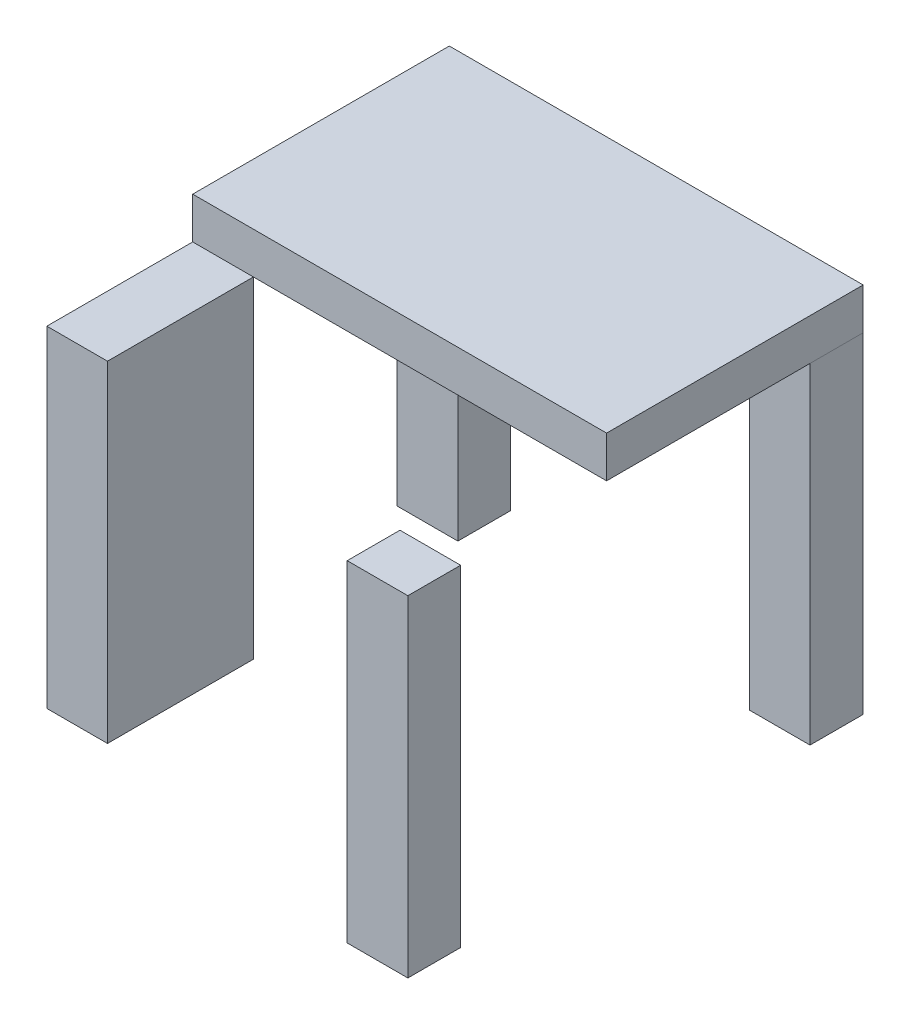
ISO-10303-21;
HEADER;
FILE_DESCRIPTION(('STEP AP214'),'2;1');
FILE_NAME('part.step','',(''),(''),'','','');
FILE_SCHEMA(('AUTOMOTIVE_DESIGN { 1 0 10303 214 1 1 1 1 }'));
ENDSEC;
DATA;
#1=APPLICATION_CONTEXT('core data for automotive mechanical design processes');
#2=APPLICATION_PROTOCOL_DEFINITION('international standard','automotive_design',2000,#1);
#3=PRODUCT_CONTEXT('',#1,'mechanical');
#4=PRODUCT('Part','Part','',(#3));
#5=PRODUCT_RELATED_PRODUCT_CATEGORY('part','',(#4));
#6=PRODUCT_DEFINITION_FORMATION('','',#4);
#7=PRODUCT_DEFINITION_CONTEXT('part definition',#1,'design');
#8=PRODUCT_DEFINITION('design','',#6,#7);
#9=PRODUCT_DEFINITION_SHAPE('','',#8);
#10=(LENGTH_UNIT() NAMED_UNIT(*) SI_UNIT(.MILLI.,.METRE.));
#11=(NAMED_UNIT(*) PLANE_ANGLE_UNIT() SI_UNIT($,.RADIAN.));
#12=(NAMED_UNIT(*) SI_UNIT($,.STERADIAN.) SOLID_ANGLE_UNIT());
#13=UNCERTAINTY_MEASURE_WITH_UNIT(LENGTH_MEASURE(1.E-05),#10,'distance_accuracy_value','');
#14=(GEOMETRIC_REPRESENTATION_CONTEXT(3) GLOBAL_UNCERTAINTY_ASSIGNED_CONTEXT((#13)) GLOBAL_UNIT_ASSIGNED_CONTEXT((#10,
#11,#12)) REPRESENTATION_CONTEXT('',''));
#15=CARTESIAN_POINT('',(0.,0.,0.));
#16=DIRECTION('',(0.,0.,1.));
#17=DIRECTION('',(1.,0.,0.));
#18=AXIS2_PLACEMENT_3D('',#15,#16,#17);
#19=CARTESIAN_POINT('',(85.36181093433,-80.,110.034688240795));
#20=DIRECTION('',(1.,0.,0.));
#21=DIRECTION('',(0.,0.,-1.));
#22=AXIS2_PLACEMENT_3D('',#19,#20,#21);
#23=PLANE('',#22);
#24=DIRECTION('',(0.,0.,-1.));
#25=VECTOR('',#24,1.);
#26=CARTESIAN_POINT('',(85.36181093433,0.,110.034688240795));
#27=LINE('',#26,#25);
#28=CARTESIAN_POINT('',(85.36181093433,0.,110.034688240795));
#29=VERTEX_POINT('',#28);
#30=CARTESIAN_POINT('',(85.36181093433,0.,97.2842820171065));
#31=VERTEX_POINT('',#30);
#32=EDGE_CURVE('E107',#29,#31,#27,.T.);
#33=ORIENTED_EDGE('',*,*,#32,.T.);
#34=DIRECTION('',(0.,1.,0.));
#35=VECTOR('',#34,1.);
#36=CARTESIAN_POINT('',(85.36181093433,-80.,97.2842820171065));
#37=LINE('',#36,#35);
#38=CARTESIAN_POINT('',(85.36181093433,-80.,97.2842820171065));
#39=VERTEX_POINT('',#38);
#40=EDGE_CURVE('E12',#39,#31,#37,.T.);
#41=ORIENTED_EDGE('',*,*,#40,.F.);
#42=DIRECTION('',(0.,0.,-1.));
#43=VECTOR('',#42,1.);
#44=CARTESIAN_POINT('',(85.36181093433,-80.,110.034688240795));
#45=LINE('',#44,#43);
#46=CARTESIAN_POINT('',(85.36181093433,-80.,110.034688240795));
#47=VERTEX_POINT('',#46);
#48=EDGE_CURVE('E95',#47,#39,#45,.T.);
#49=ORIENTED_EDGE('',*,*,#48,.F.);
#50=DIRECTION('',(0.,1.,0.));
#51=VECTOR('',#50,1.);
#52=CARTESIAN_POINT('',(85.36181093433,-80.,110.034688240795));
#53=LINE('',#52,#51);
#54=EDGE_CURVE('E103',#47,#29,#53,.T.);
#55=ORIENTED_EDGE('',*,*,#54,.T.);
#56=EDGE_LOOP('',(#33,#41,#49,#55));
#57=FACE_BOUND('',#56,.T.);
#58=ADVANCED_FACE('F44',(#57),#23,.F.);
#59=CARTESIAN_POINT('',(85.36181093433,-80.,97.2842820171065));
#60=DIRECTION('',(0.,0.,1.));
#61=DIRECTION('',(1.,0.,0.));
#62=AXIS2_PLACEMENT_3D('',#59,#60,#61);
#63=PLANE('',#62);
#64=DIRECTION('',(1.,0.,0.));
#65=VECTOR('',#64,1.);
#66=CARTESIAN_POINT('',(85.36181093433,0.,97.2842820171065));
#67=LINE('',#66,#65);
#68=CARTESIAN_POINT('',(100.019107271016,0.,97.2842820171065));
#69=VERTEX_POINT('',#68);
#70=EDGE_CURVE('E99',#31,#69,#67,.T.);
#71=ORIENTED_EDGE('',*,*,#70,.T.);
#72=DIRECTION('',(0.,1.,0.));
#73=VECTOR('',#72,1.);
#74=CARTESIAN_POINT('',(100.019107271016,-80.,97.2842820171065));
#75=LINE('',#74,#73);
#76=CARTESIAN_POINT('',(100.019107271016,-80.,97.2842820171065));
#77=VERTEX_POINT('',#76);
#78=EDGE_CURVE('E52',#77,#69,#75,.T.);
#79=ORIENTED_EDGE('',*,*,#78,.F.);
#80=DIRECTION('',(1.,0.,0.));
#81=VECTOR('',#80,1.);
#82=CARTESIAN_POINT('',(85.36181093433,-80.,97.2842820171065));
#83=LINE('',#82,#81);
#84=EDGE_CURVE('E90',#39,#77,#83,.T.);
#85=ORIENTED_EDGE('',*,*,#84,.F.);
#86=ORIENTED_EDGE('',*,*,#40,.T.);
#87=EDGE_LOOP('',(#71,#79,#85,#86));
#88=FACE_BOUND('',#87,.T.);
#89=ADVANCED_FACE('F98',(#88),#63,.F.);
#90=CARTESIAN_POINT('',(100.019107271016,-80.,110.034688240795));
#91=DIRECTION('',(-1.,0.,0.));
#92=DIRECTION('',(0.,0.,1.));
#93=AXIS2_PLACEMENT_3D('',#90,#91,#92);
#94=PLANE('',#93);
#95=DIRECTION('',(0.,0.,1.));
#96=VECTOR('',#95,1.);
#97=CARTESIAN_POINT('',(100.019107271016,0.,110.034688240795));
#98=LINE('',#97,#96);
#99=CARTESIAN_POINT('',(100.019107271016,0.,110.034688240795));
#100=VERTEX_POINT('',#99);
#101=EDGE_CURVE('E77',#69,#100,#98,.T.);
#102=ORIENTED_EDGE('',*,*,#101,.T.);
#103=DIRECTION('',(0.,1.,0.));
#104=VECTOR('',#103,1.);
#105=CARTESIAN_POINT('',(100.019107271016,-80.,110.034688240795));
#106=LINE('',#105,#104);
#107=CARTESIAN_POINT('',(100.019107271016,-80.,110.034688240795));
#108=VERTEX_POINT('',#107);
#109=EDGE_CURVE('E100',#108,#100,#106,.T.);
#110=ORIENTED_EDGE('',*,*,#109,.F.);
#111=DIRECTION('',(0.,0.,1.));
#112=VECTOR('',#111,1.);
#113=CARTESIAN_POINT('',(100.019107271016,-80.,110.034688240795));
#114=LINE('',#113,#112);
#115=EDGE_CURVE('E93',#77,#108,#114,.T.);
#116=ORIENTED_EDGE('',*,*,#115,.F.);
#117=ORIENTED_EDGE('',*,*,#78,.T.);
#118=EDGE_LOOP('',(#102,#110,#116,#117));
#119=FACE_BOUND('',#118,.T.);
#120=ADVANCED_FACE('F101',(#119),#94,.F.);
#121=CARTESIAN_POINT('',(85.36181093433,-80.,110.034688240795));
#122=DIRECTION('',(0.,0.,-1.));
#123=DIRECTION('',(-1.,0.,0.));
#124=AXIS2_PLACEMENT_3D('',#121,#122,#123);
#125=PLANE('',#124);
#126=DIRECTION('',(-1.,0.,0.));
#127=VECTOR('',#126,1.);
#128=CARTESIAN_POINT('',(85.36181093433,0.,110.034688240795));
#129=LINE('',#128,#127);
#130=EDGE_CURVE('E83',#100,#29,#129,.T.);
#131=ORIENTED_EDGE('',*,*,#130,.T.);
#132=ORIENTED_EDGE('',*,*,#54,.F.);
#133=DIRECTION('',(-1.,0.,0.));
#134=VECTOR('',#133,1.);
#135=CARTESIAN_POINT('',(85.36181093433,-80.,110.034688240795));
#136=LINE('',#135,#134);
#137=EDGE_CURVE('E60',#108,#47,#136,.T.);
#138=ORIENTED_EDGE('',*,*,#137,.F.);
#139=ORIENTED_EDGE('',*,*,#109,.T.);
#140=EDGE_LOOP('',(#131,#132,#138,#139));
#141=FACE_BOUND('',#140,.T.);
#142=ADVANCED_FACE('F114',(#141),#125,.F.);
#143=CARTESIAN_POINT('',(0.,-80.,0.));
#144=DIRECTION('',(0.,-1.,0.));
#145=DIRECTION('',(0.,0.,-1.));
#146=AXIS2_PLACEMENT_3D('',#143,#144,#145);
#147=PLANE('',#146);
#148=ORIENTED_EDGE('',*,*,#48,.T.);
#149=ORIENTED_EDGE('',*,*,#84,.T.);
#150=ORIENTED_EDGE('',*,*,#115,.T.);
#151=ORIENTED_EDGE('',*,*,#137,.T.);
#152=EDGE_LOOP('',(#148,#149,#150,#151));
#153=FACE_BOUND('',#152,.T.);
#154=ADVANCED_FACE('F91',(#153),#147,.T.);
#155=CARTESIAN_POINT('',(0.,0.,0.));
#156=DIRECTION('',(0.,-1.,0.));
#157=DIRECTION('',(0.,0.,-1.));
#158=AXIS2_PLACEMENT_3D('',#155,#156,#157);
#159=PLANE('',#158);
#160=ORIENTED_EDGE('',*,*,#32,.F.);
#161=ORIENTED_EDGE('',*,*,#130,.F.);
#162=ORIENTED_EDGE('',*,*,#101,.F.);
#163=ORIENTED_EDGE('',*,*,#70,.F.);
#164=EDGE_LOOP('',(#160,#161,#162,#163));
#165=FACE_BOUND('',#164,.T.);
#166=ADVANCED_FACE('F117',(#165),#159,.F.);
#167=CLOSED_SHELL('',(#58,#89,#120,#142,#154,#166));
#168=MANIFOLD_SOLID_BREP('B2',#167);
#169=CARTESIAN_POINT('',(0.,-80.,62.));
#170=DIRECTION('',(1.,0.,0.));
#171=DIRECTION('',(0.,0.,-1.));
#172=AXIS2_PLACEMENT_3D('',#169,#170,#171);
#173=PLANE('',#172);
#174=DIRECTION('',(0.,0.,-1.));
#175=VECTOR('',#174,1.);
#176=CARTESIAN_POINT('',(0.,0.,62.));
#177=LINE('',#176,#175);
#178=CARTESIAN_POINT('',(0.,0.,97.2495937763114));
#179=VERTEX_POINT('',#178);
#180=CARTESIAN_POINT('',(0.,0.,62.));
#181=VERTEX_POINT('',#180);
#182=EDGE_CURVE('E240',#179,#181,#177,.T.);
#183=ORIENTED_EDGE('',*,*,#182,.T.);
#184=DIRECTION('',(0.,1.,0.));
#185=VECTOR('',#184,1.);
#186=CARTESIAN_POINT('',(0.,-80.,62.));
#187=LINE('',#186,#185);
#188=CARTESIAN_POINT('',(0.,-80.,62.));
#189=VERTEX_POINT('',#188);
#190=EDGE_CURVE('E42',#189,#181,#187,.T.);
#191=ORIENTED_EDGE('',*,*,#190,.F.);
#192=DIRECTION('',(0.,0.,-1.));
#193=VECTOR('',#192,1.);
#194=CARTESIAN_POINT('',(0.,-80.,62.));
#195=LINE('',#194,#193);
#196=CARTESIAN_POINT('',(0.,-80.,97.2495937763114));
#197=VERTEX_POINT('',#196);
#198=EDGE_CURVE('E228',#197,#189,#195,.T.);
#199=ORIENTED_EDGE('',*,*,#198,.F.);
#200=DIRECTION('',(0.,1.,0.));
#201=VECTOR('',#200,1.);
#202=CARTESIAN_POINT('',(0.,-80.,97.2495937763114));
#203=LINE('',#202,#201);
#204=EDGE_CURVE('E236',#197,#179,#203,.T.);
#205=ORIENTED_EDGE('',*,*,#204,.T.);
#206=EDGE_LOOP('',(#183,#191,#199,#205));
#207=FACE_BOUND('',#206,.T.);
#208=ADVANCED_FACE('F177',(#207),#173,.F.);
#209=CARTESIAN_POINT('',(0.,-80.,62.));
#210=DIRECTION('',(0.,0.,1.));
#211=DIRECTION('',(1.,0.,0.));
#212=AXIS2_PLACEMENT_3D('',#209,#210,#211);
#213=PLANE('',#212);
#214=DIRECTION('',(1.,0.,0.));
#215=VECTOR('',#214,1.);
#216=CARTESIAN_POINT('',(0.,0.,62.));
#217=LINE('',#216,#215);
#218=CARTESIAN_POINT('',(14.6572963366857,0.,62.));
#219=VERTEX_POINT('',#218);
#220=EDGE_CURVE('E232',#181,#219,#217,.T.);
#221=ORIENTED_EDGE('',*,*,#220,.T.);
#222=DIRECTION('',(0.,1.,0.));
#223=VECTOR('',#222,1.);
#224=CARTESIAN_POINT('',(14.6572963366857,-80.,62.));
#225=LINE('',#224,#223);
#226=CARTESIAN_POINT('',(14.6572963366857,-80.,62.));
#227=VERTEX_POINT('',#226);
#228=EDGE_CURVE('E185',#227,#219,#225,.T.);
#229=ORIENTED_EDGE('',*,*,#228,.F.);
#230=DIRECTION('',(1.,0.,0.));
#231=VECTOR('',#230,1.);
#232=CARTESIAN_POINT('',(0.,-80.,62.));
#233=LINE('',#232,#231);
#234=EDGE_CURVE('E223',#189,#227,#233,.T.);
#235=ORIENTED_EDGE('',*,*,#234,.F.);
#236=ORIENTED_EDGE('',*,*,#190,.T.);
#237=EDGE_LOOP('',(#221,#229,#235,#236));
#238=FACE_BOUND('',#237,.T.);
#239=ADVANCED_FACE('F231',(#238),#213,.F.);
#240=CARTESIAN_POINT('',(14.6572963366857,-80.,62.));
#241=DIRECTION('',(-1.,0.,0.));
#242=DIRECTION('',(0.,0.,1.));
#243=AXIS2_PLACEMENT_3D('',#240,#241,#242);
#244=PLANE('',#243);
#245=DIRECTION('',(0.,0.,1.));
#246=VECTOR('',#245,1.);
#247=CARTESIAN_POINT('',(14.6572963366857,0.,62.));
#248=LINE('',#247,#246);
#249=CARTESIAN_POINT('',(14.6572963366857,0.,97.2495937763114));
#250=VERTEX_POINT('',#249);
#251=EDGE_CURVE('E210',#219,#250,#248,.T.);
#252=ORIENTED_EDGE('',*,*,#251,.T.);
#253=DIRECTION('',(0.,1.,0.));
#254=VECTOR('',#253,1.);
#255=CARTESIAN_POINT('',(14.6572963366857,-80.,97.2495937763114));
#256=LINE('',#255,#254);
#257=CARTESIAN_POINT('',(14.6572963366857,-80.,97.2495937763114));
#258=VERTEX_POINT('',#257);
#259=EDGE_CURVE('E233',#258,#250,#256,.T.);
#260=ORIENTED_EDGE('',*,*,#259,.F.);
#261=DIRECTION('',(0.,0.,1.));
#262=VECTOR('',#261,1.);
#263=CARTESIAN_POINT('',(14.6572963366857,-80.,62.));
#264=LINE('',#263,#262);
#265=EDGE_CURVE('E226',#227,#258,#264,.T.);
#266=ORIENTED_EDGE('',*,*,#265,.F.);
#267=ORIENTED_EDGE('',*,*,#228,.T.);
#268=EDGE_LOOP('',(#252,#260,#266,#267));
#269=FACE_BOUND('',#268,.T.);
#270=ADVANCED_FACE('F234',(#269),#244,.F.);
#271=CARTESIAN_POINT('',(0.,-80.,97.2495937763114));
#272=DIRECTION('',(0.,0.,-1.));
#273=DIRECTION('',(-1.,0.,0.));
#274=AXIS2_PLACEMENT_3D('',#271,#272,#273);
#275=PLANE('',#274);
#276=DIRECTION('',(-1.,0.,0.));
#277=VECTOR('',#276,1.);
#278=CARTESIAN_POINT('',(0.,0.,97.2495937763114));
#279=LINE('',#278,#277);
#280=EDGE_CURVE('E216',#250,#179,#279,.T.);
#281=ORIENTED_EDGE('',*,*,#280,.T.);
#282=ORIENTED_EDGE('',*,*,#204,.F.);
#283=DIRECTION('',(-1.,0.,0.));
#284=VECTOR('',#283,1.);
#285=CARTESIAN_POINT('',(0.,-80.,97.2495937763114));
#286=LINE('',#285,#284);
#287=EDGE_CURVE('E193',#258,#197,#286,.T.);
#288=ORIENTED_EDGE('',*,*,#287,.F.);
#289=ORIENTED_EDGE('',*,*,#259,.T.);
#290=EDGE_LOOP('',(#281,#282,#288,#289));
#291=FACE_BOUND('',#290,.T.);
#292=ADVANCED_FACE('F247',(#291),#275,.F.);
#293=CARTESIAN_POINT('',(0.,-80.,0.));
#294=DIRECTION('',(0.,1.,0.));
#295=DIRECTION('',(0.,0.,1.));
#296=AXIS2_PLACEMENT_3D('',#293,#294,#295);
#297=PLANE('',#296);
#298=ORIENTED_EDGE('',*,*,#198,.T.);
#299=ORIENTED_EDGE('',*,*,#234,.T.);
#300=ORIENTED_EDGE('',*,*,#265,.T.);
#301=ORIENTED_EDGE('',*,*,#287,.T.);
#302=EDGE_LOOP('',(#298,#299,#300,#301));
#303=FACE_BOUND('',#302,.T.);
#304=ADVANCED_FACE('F224',(#303),#297,.F.);
#305=CARTESIAN_POINT('',(0.,0.,0.));
#306=DIRECTION('',(0.,1.,0.));
#307=DIRECTION('',(0.,0.,1.));
#308=AXIS2_PLACEMENT_3D('',#305,#306,#307);
#309=PLANE('',#308);
#310=ORIENTED_EDGE('',*,*,#182,.F.);
#311=ORIENTED_EDGE('',*,*,#280,.F.);
#312=ORIENTED_EDGE('',*,*,#251,.F.);
#313=ORIENTED_EDGE('',*,*,#220,.F.);
#314=EDGE_LOOP('',(#310,#311,#312,#313));
#315=FACE_BOUND('',#314,.T.);
#316=ADVANCED_FACE('F250',(#315),#309,.T.);
#317=CLOSED_SHELL('',(#208,#239,#270,#292,#304,#316));
#318=MANIFOLD_SOLID_BREP('B6',#317);
#319=CARTESIAN_POINT('',(0.,0.,62.));
#320=DIRECTION('',(0.,1.,0.));
#321=DIRECTION('',(0.,0.,1.));
#322=AXIS2_PLACEMENT_3D('',#319,#320,#321);
#323=PLANE('',#322);
#324=DIRECTION('',(0.,0.,-1.));
#325=VECTOR('',#324,1.);
#326=CARTESIAN_POINT('',(85.2148558255428,0.,12.7157179828936));
#327=LINE('',#326,#325);
#328=CARTESIAN_POINT('',(85.2148558255428,0.,12.7157179828936));
#329=VERTEX_POINT('',#328);
#330=CARTESIAN_POINT('',(85.2148558255428,0.,0.));
#331=VERTEX_POINT('',#330);
#332=EDGE_CURVE('E318',#329,#331,#327,.T.);
#333=ORIENTED_EDGE('',*,*,#332,.F.);
#334=DIRECTION('',(-1.,0.,0.));
#335=VECTOR('',#334,1.);
#336=CARTESIAN_POINT('',(85.2148558255428,0.,12.7157179828936));
#337=LINE('',#336,#335);
#338=CARTESIAN_POINT('',(99.8721521622285,0.,12.7157179828936));
#339=VERTEX_POINT('',#338);
#340=EDGE_CURVE('E322',#339,#329,#337,.T.);
#341=ORIENTED_EDGE('',*,*,#340,.F.);
#342=DIRECTION('',(0.,0.,1.));
#343=VECTOR('',#342,1.);
#344=CARTESIAN_POINT('',(99.8721521622285,0.,12.7157179828936));
#345=LINE('',#344,#343);
#346=CARTESIAN_POINT('',(99.8721521622285,0.,0.));
#347=VERTEX_POINT('',#346);
#348=EDGE_CURVE('E647',#347,#339,#345,.T.);
#349=ORIENTED_EDGE('',*,*,#348,.F.);
#350=DIRECTION('',(1.,0.,0.));
#351=VECTOR('',#350,1.);
#352=CARTESIAN_POINT('',(0.,0.,0.));
#353=LINE('',#352,#351);
#354=CARTESIAN_POINT('',(100.,0.,0.));
#355=VERTEX_POINT('',#354);
#356=EDGE_CURVE('E478',#347,#355,#353,.T.);
#357=ORIENTED_EDGE('',*,*,#356,.T.);
#358=DIRECTION('',(0.,0.,-1.));
#359=VECTOR('',#358,1.);
#360=CARTESIAN_POINT('',(100.,0.,62.));
#361=LINE('',#360,#359);
#362=CARTESIAN_POINT('',(100.,0.,62.));
#363=VERTEX_POINT('',#362);
#364=EDGE_CURVE('E490',#363,#355,#361,.T.);
#365=ORIENTED_EDGE('',*,*,#364,.F.);
#366=DIRECTION('',(1.,0.,0.));
#367=VECTOR('',#366,1.);
#368=CARTESIAN_POINT('',(0.,0.,62.));
#369=LINE('',#368,#367);
#370=CARTESIAN_POINT('',(0.,0.,62.));
#371=VERTEX_POINT('',#370);
#372=EDGE_CURVE('E468',#371,#363,#369,.T.);
#373=ORIENTED_EDGE('',*,*,#372,.F.);
#374=DIRECTION('',(0.,0.,-1.));
#375=VECTOR('',#374,1.);
#376=CARTESIAN_POINT('',(0.,0.,62.));
#377=LINE('',#376,#375);
#378=CARTESIAN_POINT('',(0.,0.,12.5687628741064));
#379=VERTEX_POINT('',#378);
#380=EDGE_CURVE('E305',#371,#379,#377,.T.);
#381=ORIENTED_EDGE('',*,*,#380,.T.);
#382=DIRECTION('',(-1.,0.,0.));
#383=VECTOR('',#382,1.);
#384=CARTESIAN_POINT('',(-0.0191072710157194,0.,12.5687628741064));
#385=LINE('',#384,#383);
#386=CARTESIAN_POINT('',(14.63818906567,0.,12.5687628741064));
#387=VERTEX_POINT('',#386);
#388=EDGE_CURVE('E441',#387,#379,#385,.T.);
#389=ORIENTED_EDGE('',*,*,#388,.F.);
#390=DIRECTION('',(0.,0.,1.));
#391=VECTOR('',#390,1.);
#392=CARTESIAN_POINT('',(14.63818906567,0.,12.5687628741064));
#393=LINE('',#392,#391);
#394=CARTESIAN_POINT('',(14.63818906567,0.,0.));
#395=VERTEX_POINT('',#394);
#396=EDGE_CURVE('E175',#395,#387,#393,.T.);
#397=ORIENTED_EDGE('',*,*,#396,.F.);
#398=EDGE_CURVE('E483',#395,#331,#353,.T.);
#399=ORIENTED_EDGE('',*,*,#398,.T.);
#400=EDGE_LOOP('',(#333,#341,#349,#357,#365,#373,#381,#389,#397,#399));
#401=FACE_BOUND('',#400,.T.);
#402=ADVANCED_FACE('F301',(#401),#323,.F.);
#403=CARTESIAN_POINT('',(0.,0.,62.));
#404=DIRECTION('',(1.,0.,0.));
#405=DIRECTION('',(0.,0.,-1.));
#406=AXIS2_PLACEMENT_3D('',#403,#404,#405);
#407=PLANE('',#406);
#408=DIRECTION('',(0.,-1.,0.));
#409=VECTOR('',#408,1.);
#410=CARTESIAN_POINT('',(0.,0.,0.));
#411=LINE('',#410,#409);
#412=CARTESIAN_POINT('',(0.,10.,0.));
#413=VERTEX_POINT('',#412);
#414=CARTESIAN_POINT('',(0.,0.,0.));
#415=VERTEX_POINT('',#414);
#416=EDGE_CURVE('E464',#413,#415,#411,.T.);
#417=ORIENTED_EDGE('',*,*,#416,.T.);
#418=EDGE_CURVE('E492',#379,#415,#377,.T.);
#419=ORIENTED_EDGE('',*,*,#418,.F.);
#420=ORIENTED_EDGE('',*,*,#380,.F.);
#421=DIRECTION('',(0.,-1.,0.));
#422=VECTOR('',#421,1.);
#423=CARTESIAN_POINT('',(0.,0.,62.));
#424=LINE('',#423,#422);
#425=CARTESIAN_POINT('',(0.,10.,62.));
#426=VERTEX_POINT('',#425);
#427=EDGE_CURVE('E465',#426,#371,#424,.T.);
#428=ORIENTED_EDGE('',*,*,#427,.F.);
#429=DIRECTION('',(0.,0.,-1.));
#430=VECTOR('',#429,1.);
#431=CARTESIAN_POINT('',(0.,10.,62.));
#432=LINE('',#431,#430);
#433=EDGE_CURVE('E475',#426,#413,#432,.T.);
#434=ORIENTED_EDGE('',*,*,#433,.T.);
#435=EDGE_LOOP('',(#417,#419,#420,#428,#434));
#436=FACE_BOUND('',#435,.T.);
#437=ADVANCED_FACE('F303',(#436),#407,.F.);
#438=CARTESIAN_POINT('',(100.,0.,62.));
#439=DIRECTION('',(-1.,0.,0.));
#440=DIRECTION('',(0.,0.,1.));
#441=AXIS2_PLACEMENT_3D('',#438,#439,#440);
#442=PLANE('',#441);
#443=DIRECTION('',(0.,1.,0.));
#444=VECTOR('',#443,1.);
#445=CARTESIAN_POINT('',(100.,0.,0.));
#446=LINE('',#445,#444);
#447=CARTESIAN_POINT('',(100.,10.,0.));
#448=VERTEX_POINT('',#447);
#449=EDGE_CURVE('E482',#355,#448,#446,.T.);
#450=ORIENTED_EDGE('',*,*,#449,.T.);
#451=DIRECTION('',(0.,0.,-1.));
#452=VECTOR('',#451,1.);
#453=CARTESIAN_POINT('',(100.,10.,62.));
#454=LINE('',#453,#452);
#455=CARTESIAN_POINT('',(100.,10.,62.));
#456=VERTEX_POINT('',#455);
#457=EDGE_CURVE('E488',#456,#448,#454,.T.);
#458=ORIENTED_EDGE('',*,*,#457,.F.);
#459=DIRECTION('',(0.,1.,0.));
#460=VECTOR('',#459,1.);
#461=CARTESIAN_POINT('',(100.,0.,62.));
#462=LINE('',#461,#460);
#463=EDGE_CURVE('E471',#363,#456,#462,.T.);
#464=ORIENTED_EDGE('',*,*,#463,.F.);
#465=ORIENTED_EDGE('',*,*,#364,.T.);
#466=EDGE_LOOP('',(#450,#458,#464,#465));
#467=FACE_BOUND('',#466,.T.);
#468=ADVANCED_FACE('F543',(#467),#442,.F.);
#469=CARTESIAN_POINT('',(0.,10.,62.));
#470=DIRECTION('',(0.,-1.,0.));
#471=DIRECTION('',(0.,0.,-1.));
#472=AXIS2_PLACEMENT_3D('',#469,#470,#471);
#473=PLANE('',#472);
#474=DIRECTION('',(-1.,0.,0.));
#475=VECTOR('',#474,1.);
#476=CARTESIAN_POINT('',(0.,10.,0.));
#477=LINE('',#476,#475);
#478=EDGE_CURVE('E469',#448,#413,#477,.T.);
#479=ORIENTED_EDGE('',*,*,#478,.T.);
#480=ORIENTED_EDGE('',*,*,#433,.F.);
#481=DIRECTION('',(-1.,0.,0.));
#482=VECTOR('',#481,1.);
#483=CARTESIAN_POINT('',(0.,10.,62.));
#484=LINE('',#483,#482);
#485=EDGE_CURVE('E473',#456,#426,#484,.T.);
#486=ORIENTED_EDGE('',*,*,#485,.F.);
#487=ORIENTED_EDGE('',*,*,#457,.T.);
#488=EDGE_LOOP('',(#479,#480,#486,#487));
#489=FACE_BOUND('',#488,.T.);
#490=ADVANCED_FACE('F547',(#489),#473,.F.);
#491=CARTESIAN_POINT('',(0.,0.,62.));
#492=DIRECTION('',(0.,0.,-1.));
#493=DIRECTION('',(-1.,0.,0.));
#494=AXIS2_PLACEMENT_3D('',#491,#492,#493);
#495=PLANE('',#494);
#496=ORIENTED_EDGE('',*,*,#427,.T.);
#497=ORIENTED_EDGE('',*,*,#372,.T.);
#498=ORIENTED_EDGE('',*,*,#463,.T.);
#499=ORIENTED_EDGE('',*,*,#485,.T.);
#500=EDGE_LOOP('',(#496,#497,#498,#499));
#501=FACE_BOUND('',#500,.T.);
#502=ADVANCED_FACE('F550',(#501),#495,.F.);
#503=CARTESIAN_POINT('',(0.,0.,0.));
#504=DIRECTION('',(0.,0.,-1.));
#505=DIRECTION('',(-1.,0.,0.));
#506=AXIS2_PLACEMENT_3D('',#503,#504,#505);
#507=PLANE('',#506);
#508=ORIENTED_EDGE('',*,*,#416,.F.);
#509=ORIENTED_EDGE('',*,*,#478,.F.);
#510=ORIENTED_EDGE('',*,*,#449,.F.);
#511=ORIENTED_EDGE('',*,*,#356,.F.);
#512=EDGE_CURVE('E520',#331,#347,#353,.T.);
#513=ORIENTED_EDGE('',*,*,#512,.F.);
#514=ORIENTED_EDGE('',*,*,#398,.F.);
#515=EDGE_CURVE('E479',#415,#395,#353,.T.);
#516=ORIENTED_EDGE('',*,*,#515,.F.);
#517=EDGE_LOOP('',(#508,#509,#510,#511,#513,#514,#516));
#518=FACE_BOUND('',#517,.T.);
#519=ADVANCED_FACE('F518',(#518),#507,.T.);
#520=CARTESIAN_POINT('',(0.,0.,0.));
#521=DIRECTION('',(0.,-1.,0.));
#522=DIRECTION('',(0.,0.,-1.));
#523=AXIS2_PLACEMENT_3D('',#520,#521,#522);
#524=PLANE('',#523);
#525=ORIENTED_EDGE('',*,*,#418,.T.);
#526=ORIENTED_EDGE('',*,*,#515,.T.);
#527=CARTESIAN_POINT('',(14.63818906567,0.,-0.181643349582247));
#528=VERTEX_POINT('',#527);
#529=EDGE_CURVE('E311',#528,#395,#393,.T.);
#530=ORIENTED_EDGE('',*,*,#529,.F.);
#531=DIRECTION('',(1.,0.,0.));
#532=VECTOR('',#531,1.);
#533=CARTESIAN_POINT('',(-0.0191072710157177,0.,-0.181643349582247));
#534=LINE('',#533,#532);
#535=CARTESIAN_POINT('',(-0.0191072710157177,0.,-0.181643349582247));
#536=VERTEX_POINT('',#535);
#537=EDGE_CURVE('E431',#536,#528,#534,.T.);
#538=ORIENTED_EDGE('',*,*,#537,.F.);
#539=DIRECTION('',(0.,0.,-1.));
#540=VECTOR('',#539,1.);
#541=CARTESIAN_POINT('',(-0.0191072710157194,0.,12.5687628741064));
#542=LINE('',#541,#540);
#543=CARTESIAN_POINT('',(-0.0191072710157194,0.,12.5687628741064));
#544=VERTEX_POINT('',#543);
#545=EDGE_CURVE('E428',#544,#536,#542,.T.);
#546=ORIENTED_EDGE('',*,*,#545,.F.);
#547=EDGE_CURVE('E450',#379,#544,#385,.T.);
#548=ORIENTED_EDGE('',*,*,#547,.F.);
#549=EDGE_LOOP('',(#525,#526,#530,#538,#546,#548));
#550=FACE_BOUND('',#549,.T.);
#551=ADVANCED_FACE('F505',(#550),#524,.F.);
#552=CARTESIAN_POINT('',(-0.0191072710157194,-80.,12.5687628741064));
#553=DIRECTION('',(1.,0.,0.));
#554=DIRECTION('',(0.,0.,-1.));
#555=AXIS2_PLACEMENT_3D('',#552,#553,#554);
#556=PLANE('',#555);
#557=ORIENTED_EDGE('',*,*,#545,.T.);
#558=DIRECTION('',(0.,1.,0.));
#559=VECTOR('',#558,1.);
#560=CARTESIAN_POINT('',(-0.0191072710157177,-80.,-0.181643349582247));
#561=LINE('',#560,#559);
#562=CARTESIAN_POINT('',(-0.0191072710157177,-80.,-0.181643349582247));
#563=VERTEX_POINT('',#562);
#564=EDGE_CURVE('E461',#563,#536,#561,.T.);
#565=ORIENTED_EDGE('',*,*,#564,.F.);
#566=DIRECTION('',(0.,0.,-1.));
#567=VECTOR('',#566,1.);
#568=CARTESIAN_POINT('',(-0.0191072710157194,-80.,12.5687628741064));
#569=LINE('',#568,#567);
#570=CARTESIAN_POINT('',(-0.0191072710157194,-80.,12.5687628741064));
#571=VERTEX_POINT('',#570);
#572=EDGE_CURVE('E437',#571,#563,#569,.T.);
#573=ORIENTED_EDGE('',*,*,#572,.F.);
#574=DIRECTION('',(0.,1.,0.));
#575=VECTOR('',#574,1.);
#576=CARTESIAN_POINT('',(-0.0191072710157194,-80.,12.5687628741064));
#577=LINE('',#576,#575);
#578=EDGE_CURVE('E446',#571,#544,#577,.T.);
#579=ORIENTED_EDGE('',*,*,#578,.T.);
#580=EDGE_LOOP('',(#557,#565,#573,#579));
#581=FACE_BOUND('',#580,.T.);
#582=ADVANCED_FACE('F527',(#581),#556,.F.);
#583=CARTESIAN_POINT('',(-0.0191072710157177,-80.,-0.181643349582247));
#584=DIRECTION('',(0.,0.,1.));
#585=DIRECTION('',(1.,0.,0.));
#586=AXIS2_PLACEMENT_3D('',#583,#584,#585);
#587=PLANE('',#586);
#588=ORIENTED_EDGE('',*,*,#537,.T.);
#589=DIRECTION('',(0.,1.,0.));
#590=VECTOR('',#589,1.);
#591=CARTESIAN_POINT('',(14.63818906567,-80.,-0.181643349582247));
#592=LINE('',#591,#590);
#593=CARTESIAN_POINT('',(14.63818906567,-80.,-0.181643349582247));
#594=VERTEX_POINT('',#593);
#595=EDGE_CURVE('E458',#594,#528,#592,.T.);
#596=ORIENTED_EDGE('',*,*,#595,.F.);
#597=DIRECTION('',(1.,0.,0.));
#598=VECTOR('',#597,1.);
#599=CARTESIAN_POINT('',(-0.0191072710157177,-80.,-0.181643349582247));
#600=LINE('',#599,#598);
#601=EDGE_CURVE('E440',#563,#594,#600,.T.);
#602=ORIENTED_EDGE('',*,*,#601,.F.);
#603=ORIENTED_EDGE('',*,*,#564,.T.);
#604=EDGE_LOOP('',(#588,#596,#602,#603));
#605=FACE_BOUND('',#604,.T.);
#606=ADVANCED_FACE('F524',(#605),#587,.F.);
#607=CARTESIAN_POINT('',(14.63818906567,-80.,12.5687628741064));
#608=DIRECTION('',(-1.,0.,0.));
#609=DIRECTION('',(0.,0.,1.));
#610=AXIS2_PLACEMENT_3D('',#607,#608,#609);
#611=PLANE('',#610);
#612=ORIENTED_EDGE('',*,*,#529,.T.);
#613=ORIENTED_EDGE('',*,*,#396,.T.);
#614=DIRECTION('',(0.,1.,0.));
#615=VECTOR('',#614,1.);
#616=CARTESIAN_POINT('',(14.63818906567,-80.,12.5687628741064));
#617=LINE('',#616,#615);
#618=CARTESIAN_POINT('',(14.63818906567,-80.,12.5687628741064));
#619=VERTEX_POINT('',#618);
#620=EDGE_CURVE('E455',#619,#387,#617,.T.);
#621=ORIENTED_EDGE('',*,*,#620,.F.);
#622=DIRECTION('',(0.,0.,1.));
#623=VECTOR('',#622,1.);
#624=CARTESIAN_POINT('',(14.63818906567,-80.,12.5687628741064));
#625=LINE('',#624,#623);
#626=EDGE_CURVE('E443',#594,#619,#625,.T.);
#627=ORIENTED_EDGE('',*,*,#626,.F.);
#628=ORIENTED_EDGE('',*,*,#595,.T.);
#629=EDGE_LOOP('',(#612,#613,#621,#627,#628));
#630=FACE_BOUND('',#629,.T.);
#631=ADVANCED_FACE('F513',(#630),#611,.F.);
#632=CARTESIAN_POINT('',(-0.0191072710157194,-80.,12.5687628741064));
#633=DIRECTION('',(0.,0.,-1.));
#634=DIRECTION('',(-1.,0.,0.));
#635=AXIS2_PLACEMENT_3D('',#632,#633,#634);
#636=PLANE('',#635);
#637=ORIENTED_EDGE('',*,*,#388,.T.);
#638=ORIENTED_EDGE('',*,*,#547,.T.);
#639=ORIENTED_EDGE('',*,*,#578,.F.);
#640=DIRECTION('',(-1.,0.,0.));
#641=VECTOR('',#640,1.);
#642=CARTESIAN_POINT('',(-0.0191072710157194,-80.,12.5687628741064));
#643=LINE('',#642,#641);
#644=EDGE_CURVE('E445',#619,#571,#643,.T.);
#645=ORIENTED_EDGE('',*,*,#644,.F.);
#646=ORIENTED_EDGE('',*,*,#620,.T.);
#647=EDGE_LOOP('',(#637,#638,#639,#645,#646));
#648=FACE_BOUND('',#647,.T.);
#649=ADVANCED_FACE('F508',(#648),#636,.F.);
#650=CARTESIAN_POINT('',(0.,-80.,0.));
#651=DIRECTION('',(0.,-1.,0.));
#652=DIRECTION('',(0.,0.,-1.));
#653=AXIS2_PLACEMENT_3D('',#650,#651,#652);
#654=PLANE('',#653);
#655=ORIENTED_EDGE('',*,*,#572,.T.);
#656=ORIENTED_EDGE('',*,*,#601,.T.);
#657=ORIENTED_EDGE('',*,*,#626,.T.);
#658=ORIENTED_EDGE('',*,*,#644,.T.);
#659=EDGE_LOOP('',(#655,#656,#657,#658));
#660=FACE_BOUND('',#659,.T.);
#661=ADVANCED_FACE('F529',(#660),#654,.T.);
#662=CARTESIAN_POINT('',(85.2148558255428,-80.,12.7157179828936));
#663=DIRECTION('',(1.,0.,0.));
#664=DIRECTION('',(0.,0.,-1.));
#665=AXIS2_PLACEMENT_3D('',#662,#663,#664);
#666=PLANE('',#665);
#667=ORIENTED_EDGE('',*,*,#332,.T.);
#668=CARTESIAN_POINT('',(85.2148558255428,0.,-0.0346882407950694));
#669=VERTEX_POINT('',#668);
#670=EDGE_CURVE('E426',#331,#669,#327,.T.);
#671=ORIENTED_EDGE('',*,*,#670,.T.);
#672=DIRECTION('',(0.,1.,0.));
#673=VECTOR('',#672,1.);
#674=CARTESIAN_POINT('',(85.2148558255428,-80.,-0.0346882407950694));
#675=LINE('',#674,#673);
#676=CARTESIAN_POINT('',(85.2148558255428,-80.,-0.0346882407950694));
#677=VERTEX_POINT('',#676);
#678=EDGE_CURVE('E408',#677,#669,#675,.T.);
#679=ORIENTED_EDGE('',*,*,#678,.F.);
#680=DIRECTION('',(0.,0.,-1.));
#681=VECTOR('',#680,1.);
#682=CARTESIAN_POINT('',(85.2148558255428,-80.,12.7157179828936));
#683=LINE('',#682,#681);
#684=CARTESIAN_POINT('',(85.2148558255428,-80.,12.7157179828936));
#685=VERTEX_POINT('',#684);
#686=EDGE_CURVE('E414',#685,#677,#683,.T.);
#687=ORIENTED_EDGE('',*,*,#686,.F.);
#688=DIRECTION('',(0.,1.,0.));
#689=VECTOR('',#688,1.);
#690=CARTESIAN_POINT('',(85.2148558255428,-80.,12.7157179828936));
#691=LINE('',#690,#689);
#692=EDGE_CURVE('E655',#685,#329,#691,.T.);
#693=ORIENTED_EDGE('',*,*,#692,.T.);
#694=EDGE_LOOP('',(#667,#671,#679,#687,#693));
#695=FACE_BOUND('',#694,.T.);
#696=ADVANCED_FACE('F424',(#695),#666,.F.);
#697=CARTESIAN_POINT('',(85.2148558255428,-80.,-0.0346882407950694));
#698=DIRECTION('',(0.,0.,1.));
#699=DIRECTION('',(1.,0.,0.));
#700=AXIS2_PLACEMENT_3D('',#697,#698,#699);
#701=PLANE('',#700);
#702=DIRECTION('',(1.,0.,0.));
#703=VECTOR('',#702,1.);
#704=CARTESIAN_POINT('',(85.2148558255428,0.,-0.0346882407950694));
#705=LINE('',#704,#703);
#706=CARTESIAN_POINT('',(99.8721521622285,0.,-0.0346882407950694));
#707=VERTEX_POINT('',#706);
#708=EDGE_CURVE('E651',#669,#707,#705,.T.);
#709=ORIENTED_EDGE('',*,*,#708,.T.);
#710=DIRECTION('',(0.,1.,0.));
#711=VECTOR('',#710,1.);
#712=CARTESIAN_POINT('',(99.8721521622285,-80.,-0.0346882407950694));
#713=LINE('',#712,#711);
#714=CARTESIAN_POINT('',(99.8721521622285,-80.,-0.0346882407950694));
#715=VERTEX_POINT('',#714);
#716=EDGE_CURVE('E410',#715,#707,#713,.T.);
#717=ORIENTED_EDGE('',*,*,#716,.F.);
#718=DIRECTION('',(1.,0.,0.));
#719=VECTOR('',#718,1.);
#720=CARTESIAN_POINT('',(85.2148558255428,-80.,-0.0346882407950694));
#721=LINE('',#720,#719);
#722=EDGE_CURVE('E404',#677,#715,#721,.T.);
#723=ORIENTED_EDGE('',*,*,#722,.F.);
#724=ORIENTED_EDGE('',*,*,#678,.T.);
#725=EDGE_LOOP('',(#709,#717,#723,#724));
#726=FACE_BOUND('',#725,.T.);
#727=ADVANCED_FACE('F406',(#726),#701,.F.);
#728=CARTESIAN_POINT('',(99.8721521622285,-80.,12.7157179828936));
#729=DIRECTION('',(-1.,0.,0.));
#730=DIRECTION('',(0.,0.,1.));
#731=AXIS2_PLACEMENT_3D('',#728,#729,#730);
#732=PLANE('',#731);
#733=EDGE_CURVE('E645',#707,#347,#345,.T.);
#734=ORIENTED_EDGE('',*,*,#733,.T.);
#735=ORIENTED_EDGE('',*,*,#348,.T.);
#736=DIRECTION('',(0.,1.,0.));
#737=VECTOR('',#736,1.);
#738=CARTESIAN_POINT('',(99.8721521622285,-80.,12.7157179828936));
#739=LINE('',#738,#737);
#740=CARTESIAN_POINT('',(99.8721521622285,-80.,12.7157179828936));
#741=VERTEX_POINT('',#740);
#742=EDGE_CURVE('E433',#741,#339,#739,.T.);
#743=ORIENTED_EDGE('',*,*,#742,.F.);
#744=DIRECTION('',(0.,0.,1.));
#745=VECTOR('',#744,1.);
#746=CARTESIAN_POINT('',(99.8721521622285,-80.,12.7157179828936));
#747=LINE('',#746,#745);
#748=EDGE_CURVE('E413',#715,#741,#747,.T.);
#749=ORIENTED_EDGE('',*,*,#748,.F.);
#750=ORIENTED_EDGE('',*,*,#716,.T.);
#751=EDGE_LOOP('',(#734,#735,#743,#749,#750));
#752=FACE_BOUND('',#751,.T.);
#753=ADVANCED_FACE('F602',(#752),#732,.F.);
#754=CARTESIAN_POINT('',(85.2148558255428,-80.,12.7157179828936));
#755=DIRECTION('',(0.,0.,-1.));
#756=DIRECTION('',(-1.,0.,0.));
#757=AXIS2_PLACEMENT_3D('',#754,#755,#756);
#758=PLANE('',#757);
#759=ORIENTED_EDGE('',*,*,#340,.T.);
#760=ORIENTED_EDGE('',*,*,#692,.F.);
#761=DIRECTION('',(-1.,0.,0.));
#762=VECTOR('',#761,1.);
#763=CARTESIAN_POINT('',(85.2148558255428,-80.,12.7157179828936));
#764=LINE('',#763,#762);
#765=EDGE_CURVE('E419',#741,#685,#764,.T.);
#766=ORIENTED_EDGE('',*,*,#765,.F.);
#767=ORIENTED_EDGE('',*,*,#742,.T.);
#768=EDGE_LOOP('',(#759,#760,#766,#767));
#769=FACE_BOUND('',#768,.T.);
#770=ADVANCED_FACE('F611',(#769),#758,.F.);
#771=CARTESIAN_POINT('',(0.,-80.,0.));
#772=DIRECTION('',(0.,-1.,0.));
#773=DIRECTION('',(0.,0.,-1.));
#774=AXIS2_PLACEMENT_3D('',#771,#772,#773);
#775=PLANE('',#774);
#776=ORIENTED_EDGE('',*,*,#686,.T.);
#777=ORIENTED_EDGE('',*,*,#722,.T.);
#778=ORIENTED_EDGE('',*,*,#748,.T.);
#779=ORIENTED_EDGE('',*,*,#765,.T.);
#780=EDGE_LOOP('',(#776,#777,#778,#779));
#781=FACE_BOUND('',#780,.T.);
#782=ADVANCED_FACE('F417',(#781),#775,.T.);
#783=CARTESIAN_POINT('',(0.,0.,0.));
#784=DIRECTION('',(0.,-1.,0.));
#785=DIRECTION('',(0.,0.,-1.));
#786=AXIS2_PLACEMENT_3D('',#783,#784,#785);
#787=PLANE('',#786);
#788=ORIENTED_EDGE('',*,*,#512,.T.);
#789=ORIENTED_EDGE('',*,*,#733,.F.);
#790=ORIENTED_EDGE('',*,*,#708,.F.);
#791=ORIENTED_EDGE('',*,*,#670,.F.);
#792=EDGE_LOOP('',(#788,#789,#790,#791));
#793=FACE_BOUND('',#792,.T.);
#794=ADVANCED_FACE('F630',(#793),#787,.F.);
#795=CLOSED_SHELL('',(#402,#437,#468,#490,#502,#519,#551,#582,#606,#631,#649,#661,#696,#727,
#753,#770,#782,#794));
#796=MANIFOLD_SOLID_BREP('B36',#795);
#797=ADVANCED_BREP_SHAPE_REPRESENTATION('',(#18,#168,#318,#796),#14);
#798=SHAPE_DEFINITION_REPRESENTATION(#9,#797);
ENDSEC;
END-ISO-10303-21;
